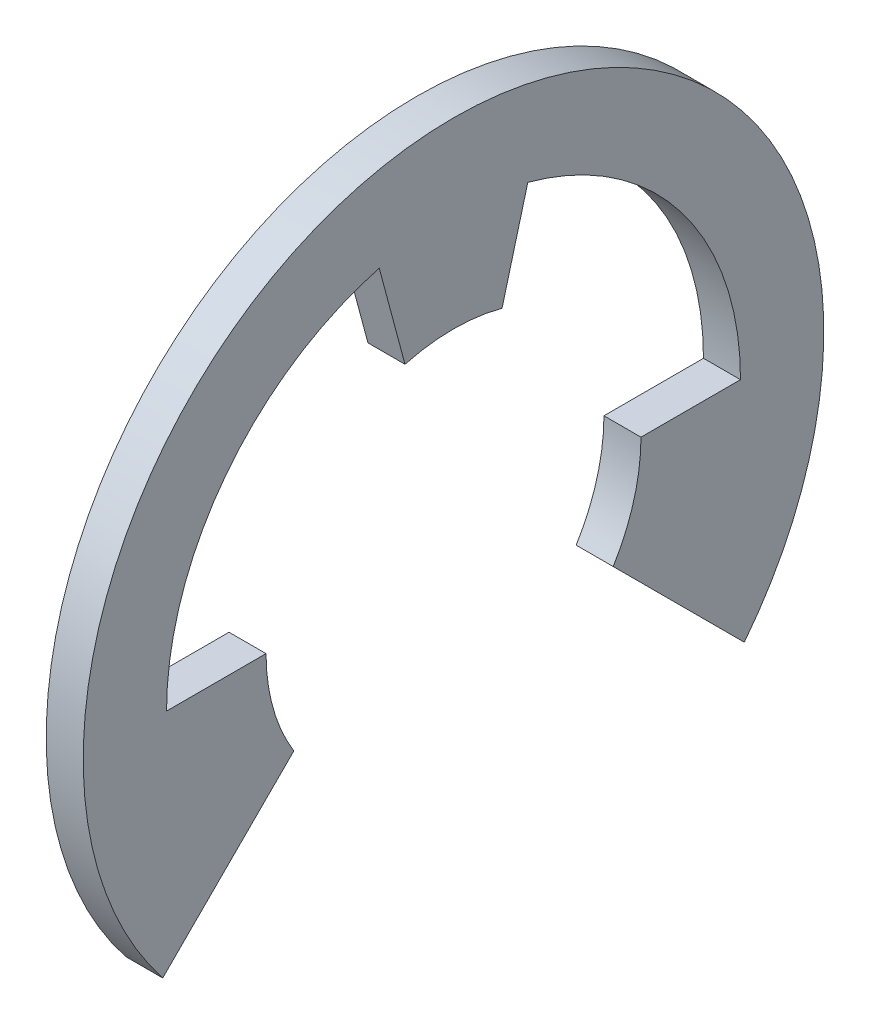
ISO-10303-21;
HEADER;
FILE_DESCRIPTION(('STEP AP214'),'2;1');
FILE_NAME('part.step','',(''),(''),'','','');
FILE_SCHEMA(('AUTOMOTIVE_DESIGN { 1 0 10303 214 1 1 1 1 }'));
ENDSEC;
DATA;
#1=APPLICATION_CONTEXT('core data for automotive mechanical design processes');
#2=APPLICATION_PROTOCOL_DEFINITION('international standard','automotive_design',2000,#1);
#3=PRODUCT_CONTEXT('',#1,'mechanical');
#4=PRODUCT('Part','Part','',(#3));
#5=PRODUCT_RELATED_PRODUCT_CATEGORY('part','',(#4));
#6=PRODUCT_DEFINITION_FORMATION('','',#4);
#7=PRODUCT_DEFINITION_CONTEXT('part definition',#1,'design');
#8=PRODUCT_DEFINITION('design','',#6,#7);
#9=PRODUCT_DEFINITION_SHAPE('','',#8);
#10=(LENGTH_UNIT() NAMED_UNIT(*) SI_UNIT(.MILLI.,.METRE.));
#11=(NAMED_UNIT(*) PLANE_ANGLE_UNIT() SI_UNIT($,.RADIAN.));
#12=(NAMED_UNIT(*) SI_UNIT($,.STERADIAN.) SOLID_ANGLE_UNIT());
#13=UNCERTAINTY_MEASURE_WITH_UNIT(LENGTH_MEASURE(1.E-05),#10,'distance_accuracy_value','');
#14=(GEOMETRIC_REPRESENTATION_CONTEXT(3) GLOBAL_UNCERTAINTY_ASSIGNED_CONTEXT((#13)) GLOBAL_UNIT_ASSIGNED_CONTEXT((#10,
#11,#12)) REPRESENTATION_CONTEXT('',''));
#15=CARTESIAN_POINT('',(0.,0.,0.));
#16=DIRECTION('',(0.,0.,1.));
#17=DIRECTION('',(1.,0.,0.));
#18=AXIS2_PLACEMENT_3D('',#15,#16,#17);
#19=CARTESIAN_POINT('',(0.8,0.,0.));
#20=DIRECTION('',(-1.,0.,0.));
#21=DIRECTION('',(0.,0.,1.));
#22=AXIS2_PLACEMENT_3D('',#19,#20,#21);
#23=CYLINDRICAL_SURFACE('',#22,4.05);
#24=CARTESIAN_POINT('',(0.,0.,0.));
#25=DIRECTION('',(-1.,0.,0.));
#26=DIRECTION('',(0.,0.,-1.));
#27=AXIS2_PLACEMENT_3D('',#24,#25,#26);
#28=CIRCLE('',#27,4.05);
#29=CARTESIAN_POINT('',(0.,-2.12132034355964,3.45));
#30=VERTEX_POINT('',#29);
#31=CARTESIAN_POINT('',(0.,0.,4.05));
#32=VERTEX_POINT('',#31);
#33=EDGE_CURVE('E154',#30,#32,#28,.T.);
#34=ORIENTED_EDGE('',*,*,#33,.T.);
#35=DIRECTION('',(-1.,0.,0.));
#36=VECTOR('',#35,1.);
#37=CARTESIAN_POINT('',(0.8,0.,4.05));
#38=LINE('',#37,#36);
#39=CARTESIAN_POINT('',(0.8,0.,4.05));
#40=VERTEX_POINT('',#39);
#41=EDGE_CURVE('E11',#40,#32,#38,.T.);
#42=ORIENTED_EDGE('',*,*,#41,.F.);
#43=CARTESIAN_POINT('',(0.8,0.,0.));
#44=DIRECTION('',(-1.,0.,0.));
#45=DIRECTION('',(0.,0.,-1.));
#46=AXIS2_PLACEMENT_3D('',#43,#44,#45);
#47=CIRCLE('',#46,4.05);
#48=CARTESIAN_POINT('',(0.8,-2.12132034355964,3.45));
#49=VERTEX_POINT('',#48);
#50=EDGE_CURVE('E176',#49,#40,#47,.T.);
#51=ORIENTED_EDGE('',*,*,#50,.F.);
#52=DIRECTION('',(-1.,0.,0.));
#53=VECTOR('',#52,1.);
#54=CARTESIAN_POINT('',(0.8,-2.12132034355964,3.45));
#55=LINE('',#54,#53);
#56=EDGE_CURVE('E150',#49,#30,#55,.T.);
#57=ORIENTED_EDGE('',*,*,#56,.T.);
#58=EDGE_LOOP('',(#34,#42,#51,#57));
#59=FACE_BOUND('',#58,.T.);
#60=ADVANCED_FACE('F34',(#59),#23,.F.);
#61=CARTESIAN_POINT('',(0.8,0.,4.05));
#62=DIRECTION('',(0.,-1.,0.));
#63=DIRECTION('',(0.,0.,-1.));
#64=AXIS2_PLACEMENT_3D('',#61,#62,#63);
#65=PLANE('',#64);
#66=DIRECTION('',(0.,0.,1.));
#67=VECTOR('',#66,1.);
#68=CARTESIAN_POINT('',(0.,0.,4.05));
#69=LINE('',#68,#67);
#70=CARTESIAN_POINT('',(0.,0.,6.2));
#71=VERTEX_POINT('',#70);
#72=EDGE_CURVE('E157',#32,#71,#69,.T.);
#73=ORIENTED_EDGE('',*,*,#72,.T.);
#74=DIRECTION('',(-1.,0.,0.));
#75=VECTOR('',#74,1.);
#76=CARTESIAN_POINT('',(0.8,0.,6.2));
#77=LINE('',#76,#75);
#78=CARTESIAN_POINT('',(0.8,0.,6.2));
#79=VERTEX_POINT('',#78);
#80=EDGE_CURVE('E42',#79,#71,#77,.T.);
#81=ORIENTED_EDGE('',*,*,#80,.F.);
#82=DIRECTION('',(0.,0.,1.));
#83=VECTOR('',#82,1.);
#84=CARTESIAN_POINT('',(0.8,0.,4.05));
#85=LINE('',#84,#83);
#86=EDGE_CURVE('E105',#40,#79,#85,.T.);
#87=ORIENTED_EDGE('',*,*,#86,.F.);
#88=ORIENTED_EDGE('',*,*,#41,.T.);
#89=EDGE_LOOP('',(#73,#81,#87,#88));
#90=FACE_BOUND('',#89,.T.);
#91=ADVANCED_FACE('F254',(#90),#65,.F.);
#92=CARTESIAN_POINT('',(0.8,0.,0.));
#93=DIRECTION('',(-1.,0.,0.));
#94=DIRECTION('',(0.,0.,1.));
#95=AXIS2_PLACEMENT_3D('',#92,#93,#94);
#96=CYLINDRICAL_SURFACE('',#95,6.2);
#97=CARTESIAN_POINT('',(0.,0.,0.));
#98=DIRECTION('',(-1.,0.,0.));
#99=DIRECTION('',(0.,0.,-1.));
#100=AXIS2_PLACEMENT_3D('',#97,#98,#99);
#101=CIRCLE('',#100,6.2);
#102=CARTESIAN_POINT('',(0.,5.9887401229922,1.6046780796357));
#103=VERTEX_POINT('',#102);
#104=EDGE_CURVE('E159',#71,#103,#101,.T.);
#105=ORIENTED_EDGE('',*,*,#104,.T.);
#106=DIRECTION('',(-1.,0.,0.));
#107=VECTOR('',#106,1.);
#108=CARTESIAN_POINT('',(0.8,5.9887401229922,1.6046780796357));
#109=LINE('',#108,#107);
#110=CARTESIAN_POINT('',(0.8,5.9887401229922,1.6046780796357));
#111=VERTEX_POINT('',#110);
#112=EDGE_CURVE('E195',#111,#103,#109,.T.);
#113=ORIENTED_EDGE('',*,*,#112,.F.);
#114=CARTESIAN_POINT('',(0.8,0.,0.));
#115=DIRECTION('',(-1.,0.,0.));
#116=DIRECTION('',(0.,0.,-1.));
#117=AXIS2_PLACEMENT_3D('',#114,#115,#116);
#118=CIRCLE('',#117,6.2);
#119=EDGE_CURVE('E203',#79,#111,#118,.T.);
#120=ORIENTED_EDGE('',*,*,#119,.F.);
#121=ORIENTED_EDGE('',*,*,#80,.T.);
#122=EDGE_LOOP('',(#105,#113,#120,#121));
#123=FACE_BOUND('',#122,.T.);
#124=ADVANCED_FACE('F201',(#123),#96,.F.);
#125=CARTESIAN_POINT('',(0.8,3.91199959647071,1.04821713266526));
#126=DIRECTION('',(0.,0.258819045102533,-0.965925826289065));
#127=DIRECTION('',(0.,0.965925826289065,0.258819045102533));
#128=AXIS2_PLACEMENT_3D('',#125,#126,#127);
#129=PLANE('',#128);
#130=DIRECTION('',(0.,-0.965925826289065,-0.258819045102533));
#131=VECTOR('',#130,1.);
#132=CARTESIAN_POINT('',(0.,3.91199959647071,1.04821713266526));
#133=LINE('',#132,#131);
#134=CARTESIAN_POINT('',(0.,3.91199959647071,1.04821713266526));
#135=VERTEX_POINT('',#134);
#136=EDGE_CURVE('E161',#103,#135,#133,.T.);
#137=ORIENTED_EDGE('',*,*,#136,.T.);
#138=DIRECTION('',(-1.,0.,0.));
#139=VECTOR('',#138,1.);
#140=CARTESIAN_POINT('',(0.8,3.91199959647071,1.04821713266526));
#141=LINE('',#140,#139);
#142=CARTESIAN_POINT('',(0.8,3.91199959647071,1.04821713266526));
#143=VERTEX_POINT('',#142);
#144=EDGE_CURVE('E192',#143,#135,#141,.T.);
#145=ORIENTED_EDGE('',*,*,#144,.F.);
#146=DIRECTION('',(0.,-0.965925826289065,-0.258819045102533));
#147=VECTOR('',#146,1.);
#148=CARTESIAN_POINT('',(0.8,3.91199959647071,1.04821713266526));
#149=LINE('',#148,#147);
#150=EDGE_CURVE('E221',#111,#143,#149,.T.);
#151=ORIENTED_EDGE('',*,*,#150,.F.);
#152=ORIENTED_EDGE('',*,*,#112,.T.);
#153=EDGE_LOOP('',(#137,#145,#151,#152));
#154=FACE_BOUND('',#153,.T.);
#155=ADVANCED_FACE('F212',(#154),#129,.F.);
#156=CARTESIAN_POINT('',(0.8,0.,0.));
#157=DIRECTION('',(-1.,0.,0.));
#158=DIRECTION('',(0.,0.,1.));
#159=AXIS2_PLACEMENT_3D('',#156,#157,#158);
#160=CYLINDRICAL_SURFACE('',#159,4.05);
#161=CARTESIAN_POINT('',(0.,0.,0.));
#162=DIRECTION('',(-1.,0.,0.));
#163=DIRECTION('',(0.,0.,-1.));
#164=AXIS2_PLACEMENT_3D('',#161,#162,#163);
#165=CIRCLE('',#164,4.05);
#166=CARTESIAN_POINT('',(0.,3.91199959647071,-1.04821713266526));
#167=VERTEX_POINT('',#166);
#168=EDGE_CURVE('E163',#135,#167,#165,.T.);
#169=ORIENTED_EDGE('',*,*,#168,.T.);
#170=DIRECTION('',(-1.,0.,0.));
#171=VECTOR('',#170,1.);
#172=CARTESIAN_POINT('',(0.8,3.91199959647071,-1.04821713266526));
#173=LINE('',#172,#171);
#174=CARTESIAN_POINT('',(0.8,3.91199959647071,-1.04821713266526));
#175=VERTEX_POINT('',#174);
#176=EDGE_CURVE('E189',#175,#167,#173,.T.);
#177=ORIENTED_EDGE('',*,*,#176,.F.);
#178=CARTESIAN_POINT('',(0.8,0.,0.));
#179=DIRECTION('',(-1.,0.,0.));
#180=DIRECTION('',(0.,0.,-1.));
#181=AXIS2_PLACEMENT_3D('',#178,#179,#180);
#182=CIRCLE('',#181,4.05);
#183=EDGE_CURVE('E218',#143,#175,#182,.T.);
#184=ORIENTED_EDGE('',*,*,#183,.F.);
#185=ORIENTED_EDGE('',*,*,#144,.T.);
#186=EDGE_LOOP('',(#169,#177,#184,#185));
#187=FACE_BOUND('',#186,.T.);
#188=ADVANCED_FACE('F216',(#187),#160,.F.);
#189=CARTESIAN_POINT('',(0.8,5.9887401229922,-1.6046780796357));
#190=DIRECTION('',(0.,0.258819045102533,0.965925826289065));
#191=DIRECTION('',(0.,-0.965925826289065,0.258819045102533));
#192=AXIS2_PLACEMENT_3D('',#189,#190,#191);
#193=PLANE('',#192);
#194=DIRECTION('',(0.,0.965925826289065,-0.258819045102533));
#195=VECTOR('',#194,1.);
#196=CARTESIAN_POINT('',(0.,5.9887401229922,-1.6046780796357));
#197=LINE('',#196,#195);
#198=CARTESIAN_POINT('',(0.,5.9887401229922,-1.6046780796357));
#199=VERTEX_POINT('',#198);
#200=EDGE_CURVE('E165',#167,#199,#197,.T.);
#201=ORIENTED_EDGE('',*,*,#200,.T.);
#202=DIRECTION('',(-1.,0.,0.));
#203=VECTOR('',#202,1.);
#204=CARTESIAN_POINT('',(0.8,5.9887401229922,-1.6046780796357));
#205=LINE('',#204,#203);
#206=CARTESIAN_POINT('',(0.8,5.9887401229922,-1.6046780796357));
#207=VERTEX_POINT('',#206);
#208=EDGE_CURVE('E186',#207,#199,#205,.T.);
#209=ORIENTED_EDGE('',*,*,#208,.F.);
#210=DIRECTION('',(0.,0.965925826289065,-0.258819045102533));
#211=VECTOR('',#210,1.);
#212=CARTESIAN_POINT('',(0.8,5.9887401229922,-1.6046780796357));
#213=LINE('',#212,#211);
#214=EDGE_CURVE('E220',#175,#207,#213,.T.);
#215=ORIENTED_EDGE('',*,*,#214,.F.);
#216=ORIENTED_EDGE('',*,*,#176,.T.);
#217=EDGE_LOOP('',(#201,#209,#215,#216));
#218=FACE_BOUND('',#217,.T.);
#219=ADVANCED_FACE('F267',(#218),#193,.F.);
#220=CARTESIAN_POINT('',(0.8,0.,0.));
#221=DIRECTION('',(-1.,0.,0.));
#222=DIRECTION('',(0.,0.,1.));
#223=AXIS2_PLACEMENT_3D('',#220,#221,#222);
#224=CYLINDRICAL_SURFACE('',#223,6.2);
#225=CARTESIAN_POINT('',(0.,0.,0.));
#226=DIRECTION('',(-1.,0.,0.));
#227=DIRECTION('',(0.,0.,-1.));
#228=AXIS2_PLACEMENT_3D('',#225,#226,#227);
#229=CIRCLE('',#228,6.2);
#230=CARTESIAN_POINT('',(0.,0.,-6.2));
#231=VERTEX_POINT('',#230);
#232=EDGE_CURVE('E167',#199,#231,#229,.T.);
#233=ORIENTED_EDGE('',*,*,#232,.T.);
#234=DIRECTION('',(-1.,0.,0.));
#235=VECTOR('',#234,1.);
#236=CARTESIAN_POINT('',(0.8,0.,-6.2));
#237=LINE('',#236,#235);
#238=CARTESIAN_POINT('',(0.8,0.,-6.2));
#239=VERTEX_POINT('',#238);
#240=EDGE_CURVE('E183',#239,#231,#237,.T.);
#241=ORIENTED_EDGE('',*,*,#240,.F.);
#242=CARTESIAN_POINT('',(0.8,0.,0.));
#243=DIRECTION('',(-1.,0.,0.));
#244=DIRECTION('',(0.,0.,-1.));
#245=AXIS2_PLACEMENT_3D('',#242,#243,#244);
#246=CIRCLE('',#245,6.2);
#247=EDGE_CURVE('E223',#207,#239,#246,.T.);
#248=ORIENTED_EDGE('',*,*,#247,.F.);
#249=ORIENTED_EDGE('',*,*,#208,.T.);
#250=EDGE_LOOP('',(#233,#241,#248,#249));
#251=FACE_BOUND('',#250,.T.);
#252=ADVANCED_FACE('F270',(#251),#224,.F.);
#253=CARTESIAN_POINT('',(0.8,0.,-4.05));
#254=DIRECTION('',(0.,-1.,0.));
#255=DIRECTION('',(0.,0.,-1.));
#256=AXIS2_PLACEMENT_3D('',#253,#254,#255);
#257=PLANE('',#256);
#258=DIRECTION('',(0.,0.,1.));
#259=VECTOR('',#258,1.);
#260=CARTESIAN_POINT('',(0.,0.,-4.05));
#261=LINE('',#260,#259);
#262=CARTESIAN_POINT('',(0.,0.,-4.05));
#263=VERTEX_POINT('',#262);
#264=EDGE_CURVE('E169',#231,#263,#261,.T.);
#265=ORIENTED_EDGE('',*,*,#264,.T.);
#266=DIRECTION('',(-1.,0.,0.));
#267=VECTOR('',#266,1.);
#268=CARTESIAN_POINT('',(0.8,0.,-4.05));
#269=LINE('',#268,#267);
#270=CARTESIAN_POINT('',(0.8,0.,-4.05));
#271=VERTEX_POINT('',#270);
#272=EDGE_CURVE('E180',#271,#263,#269,.T.);
#273=ORIENTED_EDGE('',*,*,#272,.F.);
#274=DIRECTION('',(0.,0.,1.));
#275=VECTOR('',#274,1.);
#276=CARTESIAN_POINT('',(0.8,0.,-4.05));
#277=LINE('',#276,#275);
#278=EDGE_CURVE('E229',#239,#271,#277,.T.);
#279=ORIENTED_EDGE('',*,*,#278,.F.);
#280=ORIENTED_EDGE('',*,*,#240,.T.);
#281=EDGE_LOOP('',(#265,#273,#279,#280));
#282=FACE_BOUND('',#281,.T.);
#283=ADVANCED_FACE('F235',(#282),#257,.F.);
#284=CARTESIAN_POINT('',(0.8,0.,0.));
#285=DIRECTION('',(-1.,0.,0.));
#286=DIRECTION('',(0.,0.,1.));
#287=AXIS2_PLACEMENT_3D('',#284,#285,#286);
#288=CYLINDRICAL_SURFACE('',#287,4.05);
#289=CARTESIAN_POINT('',(0.,0.,0.));
#290=DIRECTION('',(-1.,0.,0.));
#291=DIRECTION('',(0.,0.,-1.));
#292=AXIS2_PLACEMENT_3D('',#289,#290,#291);
#293=CIRCLE('',#292,4.05);
#294=CARTESIAN_POINT('',(0.,-2.12132034355964,-3.45));
#295=VERTEX_POINT('',#294);
#296=EDGE_CURVE('E171',#263,#295,#293,.T.);
#297=ORIENTED_EDGE('',*,*,#296,.T.);
#298=DIRECTION('',(-1.,0.,0.));
#299=VECTOR('',#298,1.);
#300=CARTESIAN_POINT('',(0.8,-2.12132034355964,-3.45));
#301=LINE('',#300,#299);
#302=CARTESIAN_POINT('',(0.8,-2.12132034355964,-3.45));
#303=VERTEX_POINT('',#302);
#304=EDGE_CURVE('E145',#303,#295,#301,.T.);
#305=ORIENTED_EDGE('',*,*,#304,.F.);
#306=CARTESIAN_POINT('',(0.8,0.,0.));
#307=DIRECTION('',(-1.,0.,0.));
#308=DIRECTION('',(0.,0.,-1.));
#309=AXIS2_PLACEMENT_3D('',#306,#307,#308);
#310=CIRCLE('',#309,4.05);
#311=EDGE_CURVE('E136',#271,#303,#310,.T.);
#312=ORIENTED_EDGE('',*,*,#311,.F.);
#313=ORIENTED_EDGE('',*,*,#272,.T.);
#314=EDGE_LOOP('',(#297,#305,#312,#313));
#315=FACE_BOUND('',#314,.T.);
#316=ADVANCED_FACE('F239',(#315),#288,.F.);
#317=CARTESIAN_POINT('',(0.8,-2.12132034355964,-3.45));
#318=DIRECTION('',(0.,0.707106781186547,-0.707106781186548));
#319=DIRECTION('',(0.,0.707106781186548,0.707106781186547));
#320=AXIS2_PLACEMENT_3D('',#317,#318,#319);
#321=PLANE('',#320);
#322=DIRECTION('',(0.,-0.707106781186548,-0.707106781186547));
#323=VECTOR('',#322,1.);
#324=CARTESIAN_POINT('',(0.,-2.12132034355964,-3.45));
#325=LINE('',#324,#323);
#326=CARTESIAN_POINT('',(0.,-4.95336901014448,-6.28204866658484));
#327=VERTEX_POINT('',#326);
#328=EDGE_CURVE('E144',#295,#327,#325,.T.);
#329=ORIENTED_EDGE('',*,*,#328,.T.);
#330=DIRECTION('',(-1.,0.,0.));
#331=VECTOR('',#330,1.);
#332=CARTESIAN_POINT('',(0.8,-4.95336901014448,-6.28204866658484));
#333=LINE('',#332,#331);
#334=CARTESIAN_POINT('',(0.8,-4.95336901014448,-6.28204866658484));
#335=VERTEX_POINT('',#334);
#336=EDGE_CURVE('E141',#335,#327,#333,.T.);
#337=ORIENTED_EDGE('',*,*,#336,.F.);
#338=DIRECTION('',(0.,-0.707106781186548,-0.707106781186547));
#339=VECTOR('',#338,1.);
#340=CARTESIAN_POINT('',(0.8,-2.12132034355964,-3.45));
#341=LINE('',#340,#339);
#342=EDGE_CURVE('E130',#303,#335,#341,.T.);
#343=ORIENTED_EDGE('',*,*,#342,.F.);
#344=ORIENTED_EDGE('',*,*,#304,.T.);
#345=EDGE_LOOP('',(#329,#337,#343,#344));
#346=FACE_BOUND('',#345,.T.);
#347=ADVANCED_FACE('F142',(#346),#321,.F.);
#348=CARTESIAN_POINT('',(0.8,0.,0.));
#349=DIRECTION('',(-1.,0.,0.));
#350=DIRECTION('',(0.,0.,1.));
#351=AXIS2_PLACEMENT_3D('',#348,#349,#350);
#352=CYLINDRICAL_SURFACE('',#351,8.);
#353=CARTESIAN_POINT('',(0.,0.,0.));
#354=DIRECTION('',(1.,0.,0.));
#355=DIRECTION('',(0.,0.,-1.));
#356=AXIS2_PLACEMENT_3D('',#353,#354,#355);
#357=CIRCLE('',#356,8.);
#358=CARTESIAN_POINT('',(0.,-4.95336901014448,6.28204866658483));
#359=VERTEX_POINT('',#358);
#360=EDGE_CURVE('E91',#327,#359,#357,.T.);
#361=ORIENTED_EDGE('',*,*,#360,.T.);
#362=DIRECTION('',(-1.,0.,0.));
#363=VECTOR('',#362,1.);
#364=CARTESIAN_POINT('',(0.8,-4.95336901014448,6.28204866658483));
#365=LINE('',#364,#363);
#366=CARTESIAN_POINT('',(0.8,-4.95336901014448,6.28204866658483));
#367=VERTEX_POINT('',#366);
#368=EDGE_CURVE('E146',#367,#359,#365,.T.);
#369=ORIENTED_EDGE('',*,*,#368,.F.);
#370=CARTESIAN_POINT('',(0.8,0.,0.));
#371=DIRECTION('',(1.,0.,0.));
#372=DIRECTION('',(0.,0.,-1.));
#373=AXIS2_PLACEMENT_3D('',#370,#371,#372);
#374=CIRCLE('',#373,8.);
#375=EDGE_CURVE('E134',#335,#367,#374,.T.);
#376=ORIENTED_EDGE('',*,*,#375,.F.);
#377=ORIENTED_EDGE('',*,*,#336,.T.);
#378=EDGE_LOOP('',(#361,#369,#376,#377));
#379=FACE_BOUND('',#378,.T.);
#380=ADVANCED_FACE('F148',(#379),#352,.T.);
#381=CARTESIAN_POINT('',(0.8,-2.12132034355964,3.45));
#382=DIRECTION('',(0.,0.707106781186547,0.707106781186548));
#383=DIRECTION('',(0.,-0.707106781186548,0.707106781186547));
#384=AXIS2_PLACEMENT_3D('',#381,#382,#383);
#385=PLANE('',#384);
#386=DIRECTION('',(0.,0.707106781186548,-0.707106781186547));
#387=VECTOR('',#386,1.);
#388=CARTESIAN_POINT('',(0.,-2.12132034355964,3.45));
#389=LINE('',#388,#387);
#390=EDGE_CURVE('E97',#359,#30,#389,.T.);
#391=ORIENTED_EDGE('',*,*,#390,.T.);
#392=ORIENTED_EDGE('',*,*,#56,.F.);
#393=DIRECTION('',(0.,0.707106781186548,-0.707106781186547));
#394=VECTOR('',#393,1.);
#395=CARTESIAN_POINT('',(0.8,-2.12132034355964,3.45));
#396=LINE('',#395,#394);
#397=EDGE_CURVE('E50',#367,#49,#396,.T.);
#398=ORIENTED_EDGE('',*,*,#397,.F.);
#399=ORIENTED_EDGE('',*,*,#368,.T.);
#400=EDGE_LOOP('',(#391,#392,#398,#399));
#401=FACE_BOUND('',#400,.T.);
#402=ADVANCED_FACE('F243',(#401),#385,.F.);
#403=CARTESIAN_POINT('',(0.8,0.,0.));
#404=DIRECTION('',(1.,0.,0.));
#405=DIRECTION('',(0.,0.,-1.));
#406=AXIS2_PLACEMENT_3D('',#403,#404,#405);
#407=PLANE('',#406);
#408=ORIENTED_EDGE('',*,*,#50,.T.);
#409=ORIENTED_EDGE('',*,*,#86,.T.);
#410=ORIENTED_EDGE('',*,*,#119,.T.);
#411=ORIENTED_EDGE('',*,*,#150,.T.);
#412=ORIENTED_EDGE('',*,*,#183,.T.);
#413=ORIENTED_EDGE('',*,*,#214,.T.);
#414=ORIENTED_EDGE('',*,*,#247,.T.);
#415=ORIENTED_EDGE('',*,*,#278,.T.);
#416=ORIENTED_EDGE('',*,*,#311,.T.);
#417=ORIENTED_EDGE('',*,*,#342,.T.);
#418=ORIENTED_EDGE('',*,*,#375,.T.);
#419=ORIENTED_EDGE('',*,*,#397,.T.);
#420=EDGE_LOOP('',(#408,#409,#410,#411,#412,#413,#414,#415,#416,#417,#418,#419));
#421=FACE_BOUND('',#420,.T.);
#422=ADVANCED_FACE('F132',(#421),#407,.T.);
#423=CARTESIAN_POINT('',(0.,0.,0.));
#424=DIRECTION('',(1.,0.,0.));
#425=DIRECTION('',(0.,0.,-1.));
#426=AXIS2_PLACEMENT_3D('',#423,#424,#425);
#427=PLANE('',#426);
#428=ORIENTED_EDGE('',*,*,#33,.F.);
#429=ORIENTED_EDGE('',*,*,#390,.F.);
#430=ORIENTED_EDGE('',*,*,#360,.F.);
#431=ORIENTED_EDGE('',*,*,#328,.F.);
#432=ORIENTED_EDGE('',*,*,#296,.F.);
#433=ORIENTED_EDGE('',*,*,#264,.F.);
#434=ORIENTED_EDGE('',*,*,#232,.F.);
#435=ORIENTED_EDGE('',*,*,#200,.F.);
#436=ORIENTED_EDGE('',*,*,#168,.F.);
#437=ORIENTED_EDGE('',*,*,#136,.F.);
#438=ORIENTED_EDGE('',*,*,#104,.F.);
#439=ORIENTED_EDGE('',*,*,#72,.F.);
#440=EDGE_LOOP('',(#428,#429,#430,#431,#432,#433,#434,#435,#436,#437,#438,#439));
#441=FACE_BOUND('',#440,.T.);
#442=ADVANCED_FACE('F207',(#441),#427,.F.);
#443=CLOSED_SHELL('',(#60,#91,#124,#155,#188,#219,#252,#283,#316,#347,#380,#402,#422,#442));
#444=MANIFOLD_SOLID_BREP('B2',#443);
#445=ADVANCED_BREP_SHAPE_REPRESENTATION('',(#18,#444),#14);
#446=SHAPE_DEFINITION_REPRESENTATION(#9,#445);
ENDSEC;
END-ISO-10303-21;
